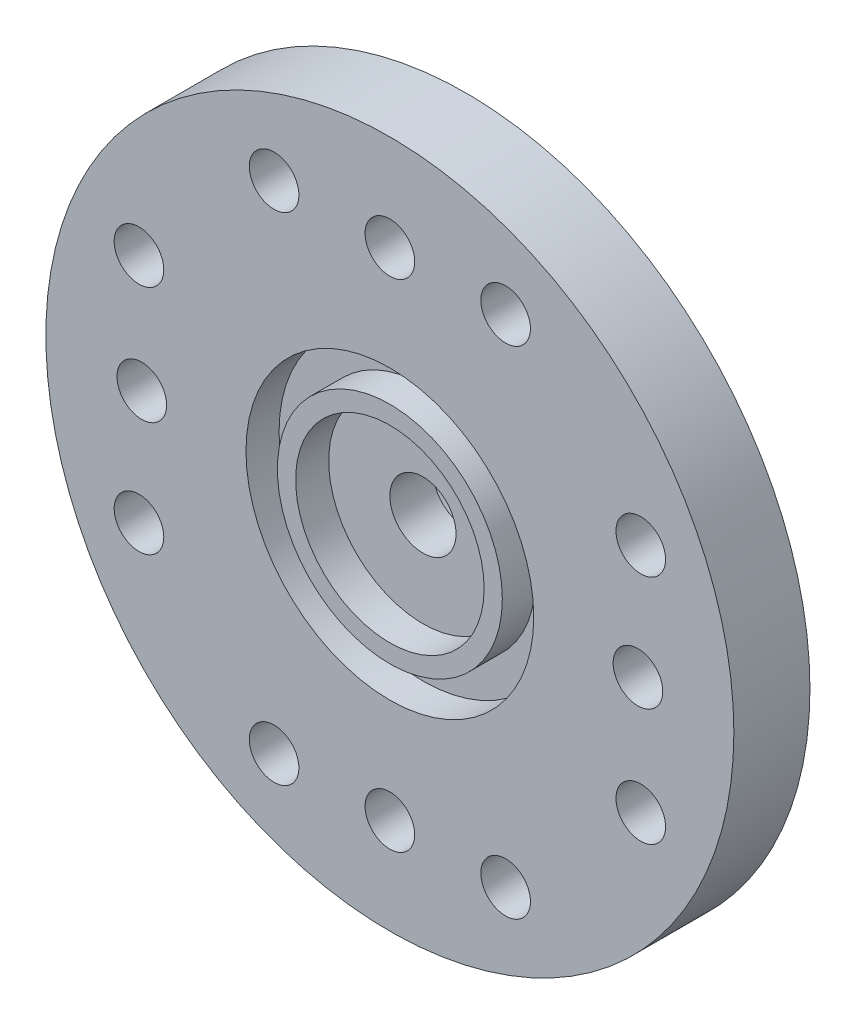
ISO-10303-21;
HEADER;
FILE_DESCRIPTION(('STEP AP214'),'2;1');
FILE_NAME('part.step','',(''),(''),'','','');
FILE_SCHEMA(('AUTOMOTIVE_DESIGN { 1 0 10303 214 1 1 1 1 }'));
ENDSEC;
DATA;
#1=APPLICATION_CONTEXT('core data for automotive mechanical design processes');
#2=APPLICATION_PROTOCOL_DEFINITION('international standard','automotive_design',2000,#1);
#3=PRODUCT_CONTEXT('',#1,'mechanical');
#4=PRODUCT('Part','Part','',(#3));
#5=PRODUCT_RELATED_PRODUCT_CATEGORY('part','',(#4));
#6=PRODUCT_DEFINITION_FORMATION('','',#4);
#7=PRODUCT_DEFINITION_CONTEXT('part definition',#1,'design');
#8=PRODUCT_DEFINITION('design','',#6,#7);
#9=PRODUCT_DEFINITION_SHAPE('','',#8);
#10=(LENGTH_UNIT() NAMED_UNIT(*) SI_UNIT(.MILLI.,.METRE.));
#11=(NAMED_UNIT(*) PLANE_ANGLE_UNIT() SI_UNIT($,.RADIAN.));
#12=(NAMED_UNIT(*) SI_UNIT($,.STERADIAN.) SOLID_ANGLE_UNIT());
#13=UNCERTAINTY_MEASURE_WITH_UNIT(LENGTH_MEASURE(1.E-05),#10,'distance_accuracy_value','');
#14=(GEOMETRIC_REPRESENTATION_CONTEXT(3) GLOBAL_UNCERTAINTY_ASSIGNED_CONTEXT((#13)) GLOBAL_UNIT_ASSIGNED_CONTEXT((#10,
#11,#12)) REPRESENTATION_CONTEXT('',''));
#15=CARTESIAN_POINT('',(0.,0.,0.));
#16=DIRECTION('',(0.,0.,1.));
#17=DIRECTION('',(1.,0.,0.));
#18=AXIS2_PLACEMENT_3D('',#15,#16,#17);
#19=CARTESIAN_POINT('',(0.,0.,2.3));
#20=DIRECTION('',(0.,0.,-1.));
#21=DIRECTION('',(-1.,0.,0.));
#22=AXIS2_PLACEMENT_3D('',#19,#20,#21);
#23=CYLINDRICAL_SURFACE('',#22,10.4);
#24=CARTESIAN_POINT('',(0.,0.,2.3));
#25=DIRECTION('',(0.,0.,1.));
#26=DIRECTION('',(1.,0.,0.));
#27=AXIS2_PLACEMENT_3D('',#24,#25,#26);
#28=CIRCLE('',#27,10.4);
#29=CARTESIAN_POINT('',(10.4,0.,2.3));
#30=VERTEX_POINT('',#29);
#31=EDGE_CURVE('E45',#30,#30,#28,.T.);
#32=ORIENTED_EDGE('',*,*,#31,.F.);
#33=EDGE_LOOP('',(#32));
#34=FACE_BOUND('',#33,.T.);
#35=CARTESIAN_POINT('',(0.,0.,0.));
#36=DIRECTION('',(0.,0.,1.));
#37=DIRECTION('',(1.,0.,0.));
#38=AXIS2_PLACEMENT_3D('',#35,#36,#37);
#39=CIRCLE('',#38,10.4);
#40=CARTESIAN_POINT('',(10.4,0.,0.));
#41=VERTEX_POINT('',#40);
#42=EDGE_CURVE('E49',#41,#41,#39,.T.);
#43=ORIENTED_EDGE('',*,*,#42,.T.);
#44=EDGE_LOOP('',(#43));
#45=FACE_BOUND('',#44,.T.);
#46=ADVANCED_FACE('F38',(#34,#45),#23,.T.);
#47=CARTESIAN_POINT('',(0.,0.,2.3));
#48=DIRECTION('',(0.,0.,1.));
#49=DIRECTION('',(1.,0.,0.));
#50=AXIS2_PLACEMENT_3D('',#47,#48,#49);
#51=PLANE('',#50);
#52=CARTESIAN_POINT('',(0.,0.,2.3));
#53=DIRECTION('',(0.,0.,1.));
#54=DIRECTION('',(1.,0.,0.));
#55=AXIS2_PLACEMENT_3D('',#52,#53,#54);
#56=CIRCLE('',#55,4.35);
#57=CARTESIAN_POINT('',(4.35,0.,2.3));
#58=VERTEX_POINT('',#57);
#59=EDGE_CURVE('E136',#58,#58,#56,.T.);
#60=ORIENTED_EDGE('',*,*,#59,.F.);
#61=EDGE_LOOP('',(#60));
#62=FACE_BOUND('',#61,.T.);
#63=CARTESIAN_POINT('',(7.5,0.,2.3));
#64=DIRECTION('',(0.,0.,1.));
#65=DIRECTION('',(1.,0.,0.));
#66=AXIS2_PLACEMENT_3D('',#63,#64,#65);
#67=CIRCLE('',#66,0.750000024000001);
#68=CARTESIAN_POINT('',(8.250000024,0.,2.3));
#69=VERTEX_POINT('',#68);
#70=EDGE_CURVE('E123',#69,#69,#67,.T.);
#71=ORIENTED_EDGE('',*,*,#70,.F.);
#72=EDGE_LOOP('',(#71));
#73=FACE_BOUND('',#72,.T.);
#74=CARTESIAN_POINT('',(7.58479022540826,3.5,2.3));
#75=DIRECTION('',(0.,0.,1.));
#76=DIRECTION('',(1.,0.,0.));
#77=AXIS2_PLACEMENT_3D('',#74,#75,#76);
#78=CIRCLE('',#77,0.750000024000001);
#79=CARTESIAN_POINT('',(8.33479024940826,3.5,2.3));
#80=VERTEX_POINT('',#79);
#81=EDGE_CURVE('E117',#80,#80,#78,.T.);
#82=ORIENTED_EDGE('',*,*,#81,.F.);
#83=EDGE_LOOP('',(#82));
#84=FACE_BOUND('',#83,.T.);
#85=CARTESIAN_POINT('',(7.58479022540826,-3.5,2.3));
#86=DIRECTION('',(0.,0.,1.));
#87=DIRECTION('',(1.,0.,0.));
#88=AXIS2_PLACEMENT_3D('',#85,#86,#87);
#89=CIRCLE('',#88,0.750000024000001);
#90=CARTESIAN_POINT('',(8.33479024940826,-3.5,2.3));
#91=VERTEX_POINT('',#90);
#92=EDGE_CURVE('E111',#91,#91,#89,.T.);
#93=ORIENTED_EDGE('',*,*,#92,.F.);
#94=EDGE_LOOP('',(#93));
#95=FACE_BOUND('',#94,.T.);
#96=CARTESIAN_POINT('',(0.,-7.5,2.3));
#97=DIRECTION('',(0.,0.,1.));
#98=DIRECTION('',(1.,0.,0.));
#99=AXIS2_PLACEMENT_3D('',#96,#97,#98);
#100=CIRCLE('',#99,0.750000024);
#101=CARTESIAN_POINT('',(0.750000024,-7.5,2.3));
#102=VERTEX_POINT('',#101);
#103=EDGE_CURVE('E105',#102,#102,#100,.T.);
#104=ORIENTED_EDGE('',*,*,#103,.F.);
#105=EDGE_LOOP('',(#104));
#106=FACE_BOUND('',#105,.T.);
#107=CARTESIAN_POINT('',(-3.5,-7.5,2.3));
#108=DIRECTION('',(0.,0.,1.));
#109=DIRECTION('',(1.,0.,0.));
#110=AXIS2_PLACEMENT_3D('',#107,#108,#109);
#111=CIRCLE('',#110,0.750000024);
#112=CARTESIAN_POINT('',(-2.749999976,-7.5,2.3));
#113=VERTEX_POINT('',#112);
#114=EDGE_CURVE('E99',#113,#113,#111,.T.);
#115=ORIENTED_EDGE('',*,*,#114,.F.);
#116=EDGE_LOOP('',(#115));
#117=FACE_BOUND('',#116,.T.);
#118=CARTESIAN_POINT('',(3.5,-7.5,2.3));
#119=DIRECTION('',(0.,0.,1.));
#120=DIRECTION('',(1.,0.,0.));
#121=AXIS2_PLACEMENT_3D('',#118,#119,#120);
#122=CIRCLE('',#121,0.750000024);
#123=CARTESIAN_POINT('',(4.250000024,-7.5,2.3));
#124=VERTEX_POINT('',#123);
#125=EDGE_CURVE('E93',#124,#124,#122,.T.);
#126=ORIENTED_EDGE('',*,*,#125,.F.);
#127=EDGE_LOOP('',(#126));
#128=FACE_BOUND('',#127,.T.);
#129=CARTESIAN_POINT('',(0.,7.5,2.3));
#130=DIRECTION('',(0.,0.,1.));
#131=DIRECTION('',(1.,0.,0.));
#132=AXIS2_PLACEMENT_3D('',#129,#130,#131);
#133=CIRCLE('',#132,0.750000024);
#134=CARTESIAN_POINT('',(0.750000024,7.5,2.3));
#135=VERTEX_POINT('',#134);
#136=EDGE_CURVE('E87',#135,#135,#133,.T.);
#137=ORIENTED_EDGE('',*,*,#136,.F.);
#138=EDGE_LOOP('',(#137));
#139=FACE_BOUND('',#138,.T.);
#140=CARTESIAN_POINT('',(-3.5,7.5,2.3));
#141=DIRECTION('',(0.,0.,1.));
#142=DIRECTION('',(1.,0.,0.));
#143=AXIS2_PLACEMENT_3D('',#140,#141,#142);
#144=CIRCLE('',#143,0.750000024);
#145=CARTESIAN_POINT('',(-2.749999976,7.5,2.3));
#146=VERTEX_POINT('',#145);
#147=EDGE_CURVE('E81',#146,#146,#144,.T.);
#148=ORIENTED_EDGE('',*,*,#147,.F.);
#149=EDGE_LOOP('',(#148));
#150=FACE_BOUND('',#149,.T.);
#151=CARTESIAN_POINT('',(3.5,7.5,2.3));
#152=DIRECTION('',(0.,0.,1.));
#153=DIRECTION('',(1.,0.,0.));
#154=AXIS2_PLACEMENT_3D('',#151,#152,#153);
#155=CIRCLE('',#154,0.750000024);
#156=CARTESIAN_POINT('',(4.250000024,7.5,2.3));
#157=VERTEX_POINT('',#156);
#158=EDGE_CURVE('E75',#157,#157,#155,.T.);
#159=ORIENTED_EDGE('',*,*,#158,.F.);
#160=EDGE_LOOP('',(#159));
#161=FACE_BOUND('',#160,.T.);
#162=CARTESIAN_POINT('',(-7.5,0.,2.3));
#163=DIRECTION('',(0.,0.,1.));
#164=DIRECTION('',(1.,0.,0.));
#165=AXIS2_PLACEMENT_3D('',#162,#163,#164);
#166=CIRCLE('',#165,0.750000024);
#167=CARTESIAN_POINT('',(-6.749999976,0.,2.3));
#168=VERTEX_POINT('',#167);
#169=EDGE_CURVE('E69',#168,#168,#166,.T.);
#170=ORIENTED_EDGE('',*,*,#169,.F.);
#171=EDGE_LOOP('',(#170));
#172=FACE_BOUND('',#171,.T.);
#173=CARTESIAN_POINT('',(-7.58479022540826,3.5,2.3));
#174=DIRECTION('',(0.,0.,1.));
#175=DIRECTION('',(1.,0.,0.));
#176=AXIS2_PLACEMENT_3D('',#173,#174,#175);
#177=CIRCLE('',#176,0.750000024);
#178=CARTESIAN_POINT('',(-6.83479020140826,3.5,2.3));
#179=VERTEX_POINT('',#178);
#180=EDGE_CURVE('E63',#179,#179,#177,.T.);
#181=ORIENTED_EDGE('',*,*,#180,.F.);
#182=EDGE_LOOP('',(#181));
#183=FACE_BOUND('',#182,.T.);
#184=CARTESIAN_POINT('',(-7.58479022540826,-3.5,2.3));
#185=DIRECTION('',(0.,0.,1.));
#186=DIRECTION('',(1.,0.,0.));
#187=AXIS2_PLACEMENT_3D('',#184,#185,#186);
#188=CIRCLE('',#187,0.750000024);
#189=CARTESIAN_POINT('',(-6.83479020140826,-3.5,2.3));
#190=VERTEX_POINT('',#189);
#191=EDGE_CURVE('E57',#190,#190,#188,.T.);
#192=ORIENTED_EDGE('',*,*,#191,.F.);
#193=EDGE_LOOP('',(#192));
#194=FACE_BOUND('',#193,.T.);
#195=ORIENTED_EDGE('',*,*,#31,.T.);
#196=EDGE_LOOP('',(#195));
#197=FACE_BOUND('',#196,.T.);
#198=ADVANCED_FACE('F174',(#62,#73,#84,#95,#106,#117,#128,#139,#150,#161,#172,#183,#194,#197),
#51,.T.);
#199=CARTESIAN_POINT('',(0.,0.,0.));
#200=DIRECTION('',(0.,0.,1.));
#201=DIRECTION('',(1.,0.,0.));
#202=AXIS2_PLACEMENT_3D('',#199,#200,#201);
#203=PLANE('',#202);
#204=CARTESIAN_POINT('',(0.,0.,0.));
#205=DIRECTION('',(0.,0.,1.));
#206=DIRECTION('',(1.,0.,0.));
#207=AXIS2_PLACEMENT_3D('',#204,#205,#206);
#208=CIRCLE('',#207,4.4);
#209=CARTESIAN_POINT('',(4.4,0.,0.));
#210=VERTEX_POINT('',#209);
#211=EDGE_CURVE('E10',#210,#210,#208,.F.);
#212=ORIENTED_EDGE('',*,*,#211,.F.);
#213=EDGE_LOOP('',(#212));
#214=FACE_BOUND('',#213,.T.);
#215=CARTESIAN_POINT('',(7.5,0.,0.));
#216=DIRECTION('',(0.,0.,1.));
#217=DIRECTION('',(1.,0.,0.));
#218=AXIS2_PLACEMENT_3D('',#215,#216,#217);
#219=CIRCLE('',#218,0.750000023999999);
#220=CARTESIAN_POINT('',(8.250000024,0.,0.));
#221=VERTEX_POINT('',#220);
#222=EDGE_CURVE('E120',#221,#221,#219,.T.);
#223=ORIENTED_EDGE('',*,*,#222,.T.);
#224=EDGE_LOOP('',(#223));
#225=FACE_BOUND('',#224,.T.);
#226=CARTESIAN_POINT('',(7.58479022540826,3.5,0.));
#227=DIRECTION('',(0.,0.,1.));
#228=DIRECTION('',(1.,0.,0.));
#229=AXIS2_PLACEMENT_3D('',#226,#227,#228);
#230=CIRCLE('',#229,0.750000023999999);
#231=CARTESIAN_POINT('',(8.33479024940825,3.5,0.));
#232=VERTEX_POINT('',#231);
#233=EDGE_CURVE('E114',#232,#232,#230,.T.);
#234=ORIENTED_EDGE('',*,*,#233,.T.);
#235=EDGE_LOOP('',(#234));
#236=FACE_BOUND('',#235,.T.);
#237=CARTESIAN_POINT('',(7.58479022540826,-3.5,0.));
#238=DIRECTION('',(0.,0.,1.));
#239=DIRECTION('',(1.,0.,0.));
#240=AXIS2_PLACEMENT_3D('',#237,#238,#239);
#241=CIRCLE('',#240,0.750000023999999);
#242=CARTESIAN_POINT('',(8.33479024940825,-3.5,0.));
#243=VERTEX_POINT('',#242);
#244=EDGE_CURVE('E108',#243,#243,#241,.T.);
#245=ORIENTED_EDGE('',*,*,#244,.T.);
#246=EDGE_LOOP('',(#245));
#247=FACE_BOUND('',#246,.T.);
#248=CARTESIAN_POINT('',(0.,-7.5,0.));
#249=DIRECTION('',(0.,0.,1.));
#250=DIRECTION('',(1.,0.,0.));
#251=AXIS2_PLACEMENT_3D('',#248,#249,#250);
#252=CIRCLE('',#251,0.750000023999999);
#253=CARTESIAN_POINT('',(0.750000023999999,-7.5,0.));
#254=VERTEX_POINT('',#253);
#255=EDGE_CURVE('E102',#254,#254,#252,.T.);
#256=ORIENTED_EDGE('',*,*,#255,.T.);
#257=EDGE_LOOP('',(#256));
#258=FACE_BOUND('',#257,.T.);
#259=CARTESIAN_POINT('',(-3.5,-7.5,0.));
#260=DIRECTION('',(0.,0.,1.));
#261=DIRECTION('',(1.,0.,0.));
#262=AXIS2_PLACEMENT_3D('',#259,#260,#261);
#263=CIRCLE('',#262,0.750000023999999);
#264=CARTESIAN_POINT('',(-2.749999976,-7.5,0.));
#265=VERTEX_POINT('',#264);
#266=EDGE_CURVE('E96',#265,#265,#263,.T.);
#267=ORIENTED_EDGE('',*,*,#266,.T.);
#268=EDGE_LOOP('',(#267));
#269=FACE_BOUND('',#268,.T.);
#270=CARTESIAN_POINT('',(3.5,-7.5,0.));
#271=DIRECTION('',(0.,0.,1.));
#272=DIRECTION('',(1.,0.,0.));
#273=AXIS2_PLACEMENT_3D('',#270,#271,#272);
#274=CIRCLE('',#273,0.750000023999999);
#275=CARTESIAN_POINT('',(4.250000024,-7.5,0.));
#276=VERTEX_POINT('',#275);
#277=EDGE_CURVE('E90',#276,#276,#274,.T.);
#278=ORIENTED_EDGE('',*,*,#277,.T.);
#279=EDGE_LOOP('',(#278));
#280=FACE_BOUND('',#279,.T.);
#281=CARTESIAN_POINT('',(0.,7.5,0.));
#282=DIRECTION('',(0.,0.,1.));
#283=DIRECTION('',(1.,0.,0.));
#284=AXIS2_PLACEMENT_3D('',#281,#282,#283);
#285=CIRCLE('',#284,0.750000023999999);
#286=CARTESIAN_POINT('',(0.750000023999999,7.5,0.));
#287=VERTEX_POINT('',#286);
#288=EDGE_CURVE('E84',#287,#287,#285,.T.);
#289=ORIENTED_EDGE('',*,*,#288,.T.);
#290=EDGE_LOOP('',(#289));
#291=FACE_BOUND('',#290,.T.);
#292=CARTESIAN_POINT('',(-3.5,7.5,0.));
#293=DIRECTION('',(0.,0.,1.));
#294=DIRECTION('',(1.,0.,0.));
#295=AXIS2_PLACEMENT_3D('',#292,#293,#294);
#296=CIRCLE('',#295,0.750000023999999);
#297=CARTESIAN_POINT('',(-2.749999976,7.5,0.));
#298=VERTEX_POINT('',#297);
#299=EDGE_CURVE('E78',#298,#298,#296,.T.);
#300=ORIENTED_EDGE('',*,*,#299,.T.);
#301=EDGE_LOOP('',(#300));
#302=FACE_BOUND('',#301,.T.);
#303=CARTESIAN_POINT('',(3.5,7.5,0.));
#304=DIRECTION('',(0.,0.,1.));
#305=DIRECTION('',(1.,0.,0.));
#306=AXIS2_PLACEMENT_3D('',#303,#304,#305);
#307=CIRCLE('',#306,0.750000023999999);
#308=CARTESIAN_POINT('',(4.250000024,7.5,0.));
#309=VERTEX_POINT('',#308);
#310=EDGE_CURVE('E72',#309,#309,#307,.T.);
#311=ORIENTED_EDGE('',*,*,#310,.T.);
#312=EDGE_LOOP('',(#311));
#313=FACE_BOUND('',#312,.T.);
#314=CARTESIAN_POINT('',(-7.5,0.,0.));
#315=DIRECTION('',(0.,0.,1.));
#316=DIRECTION('',(1.,0.,0.));
#317=AXIS2_PLACEMENT_3D('',#314,#315,#316);
#318=CIRCLE('',#317,0.750000024);
#319=CARTESIAN_POINT('',(-6.749999976,0.,0.));
#320=VERTEX_POINT('',#319);
#321=EDGE_CURVE('E66',#320,#320,#318,.T.);
#322=ORIENTED_EDGE('',*,*,#321,.T.);
#323=EDGE_LOOP('',(#322));
#324=FACE_BOUND('',#323,.T.);
#325=CARTESIAN_POINT('',(-7.58479022540826,3.5,0.));
#326=DIRECTION('',(0.,0.,1.));
#327=DIRECTION('',(1.,0.,0.));
#328=AXIS2_PLACEMENT_3D('',#325,#326,#327);
#329=CIRCLE('',#328,0.750000024);
#330=CARTESIAN_POINT('',(-6.83479020140826,3.5,0.));
#331=VERTEX_POINT('',#330);
#332=EDGE_CURVE('E60',#331,#331,#329,.T.);
#333=ORIENTED_EDGE('',*,*,#332,.T.);
#334=EDGE_LOOP('',(#333));
#335=FACE_BOUND('',#334,.T.);
#336=CARTESIAN_POINT('',(-7.58479022540826,-3.5,0.));
#337=DIRECTION('',(0.,0.,1.));
#338=DIRECTION('',(1.,0.,0.));
#339=AXIS2_PLACEMENT_3D('',#336,#337,#338);
#340=CIRCLE('',#339,0.750000024);
#341=CARTESIAN_POINT('',(-6.83479020140826,-3.5,0.));
#342=VERTEX_POINT('',#341);
#343=EDGE_CURVE('E53',#342,#342,#340,.T.);
#344=ORIENTED_EDGE('',*,*,#343,.T.);
#345=EDGE_LOOP('',(#344));
#346=FACE_BOUND('',#345,.T.);
#347=ORIENTED_EDGE('',*,*,#42,.F.);
#348=EDGE_LOOP('',(#347));
#349=FACE_BOUND('',#348,.T.);
#350=ADVANCED_FACE('F179',(#214,#225,#236,#247,#258,#269,#280,#291,#302,#313,#324,#335,#346,
#349),#203,.F.);
#351=CARTESIAN_POINT('',(-7.58479022540826,-3.5,2.3));
#352=DIRECTION('',(0.,0.,1.));
#353=DIRECTION('',(1.,0.,0.));
#354=AXIS2_PLACEMENT_3D('',#351,#352,#353);
#355=CYLINDRICAL_SURFACE('',#354,0.750000024);
#356=ORIENTED_EDGE('',*,*,#343,.F.);
#357=EDGE_LOOP('',(#356));
#358=FACE_BOUND('',#357,.T.);
#359=ORIENTED_EDGE('',*,*,#191,.T.);
#360=EDGE_LOOP('',(#359));
#361=FACE_BOUND('',#360,.T.);
#362=ADVANCED_FACE('F188',(#358,#361),#355,.F.);
#363=CARTESIAN_POINT('',(-7.58479022540826,3.5,2.3));
#364=DIRECTION('',(0.,0.,1.));
#365=DIRECTION('',(1.,0.,0.));
#366=AXIS2_PLACEMENT_3D('',#363,#364,#365);
#367=CYLINDRICAL_SURFACE('',#366,0.750000024);
#368=ORIENTED_EDGE('',*,*,#332,.F.);
#369=EDGE_LOOP('',(#368));
#370=FACE_BOUND('',#369,.T.);
#371=ORIENTED_EDGE('',*,*,#180,.T.);
#372=EDGE_LOOP('',(#371));
#373=FACE_BOUND('',#372,.T.);
#374=ADVANCED_FACE('F193',(#370,#373),#367,.F.);
#375=CARTESIAN_POINT('',(-7.5,0.,2.3));
#376=DIRECTION('',(0.,0.,1.));
#377=DIRECTION('',(1.,0.,0.));
#378=AXIS2_PLACEMENT_3D('',#375,#376,#377);
#379=CYLINDRICAL_SURFACE('',#378,0.750000024);
#380=ORIENTED_EDGE('',*,*,#321,.F.);
#381=EDGE_LOOP('',(#380));
#382=FACE_BOUND('',#381,.T.);
#383=ORIENTED_EDGE('',*,*,#169,.T.);
#384=EDGE_LOOP('',(#383));
#385=FACE_BOUND('',#384,.T.);
#386=ADVANCED_FACE('F257',(#382,#385),#379,.F.);
#387=CARTESIAN_POINT('',(3.5,7.5,2.3));
#388=DIRECTION('',(0.,0.,1.));
#389=DIRECTION('',(1.,0.,0.));
#390=AXIS2_PLACEMENT_3D('',#387,#388,#389);
#391=CYLINDRICAL_SURFACE('',#390,0.750000024);
#392=ORIENTED_EDGE('',*,*,#310,.F.);
#393=EDGE_LOOP('',(#392));
#394=FACE_BOUND('',#393,.T.);
#395=ORIENTED_EDGE('',*,*,#158,.T.);
#396=EDGE_LOOP('',(#395));
#397=FACE_BOUND('',#396,.T.);
#398=ADVANCED_FACE('F253',(#394,#397),#391,.F.);
#399=CARTESIAN_POINT('',(-3.5,7.5,2.3));
#400=DIRECTION('',(0.,0.,1.));
#401=DIRECTION('',(1.,0.,0.));
#402=AXIS2_PLACEMENT_3D('',#399,#400,#401);
#403=CYLINDRICAL_SURFACE('',#402,0.750000023999999);
#404=ORIENTED_EDGE('',*,*,#299,.F.);
#405=EDGE_LOOP('',(#404));
#406=FACE_BOUND('',#405,.T.);
#407=ORIENTED_EDGE('',*,*,#147,.T.);
#408=EDGE_LOOP('',(#407));
#409=FACE_BOUND('',#408,.T.);
#410=ADVANCED_FACE('F249',(#406,#409),#403,.F.);
#411=CARTESIAN_POINT('',(0.,7.5,2.3));
#412=DIRECTION('',(0.,0.,1.));
#413=DIRECTION('',(1.,0.,0.));
#414=AXIS2_PLACEMENT_3D('',#411,#412,#413);
#415=CYLINDRICAL_SURFACE('',#414,0.750000023999999);
#416=ORIENTED_EDGE('',*,*,#288,.F.);
#417=EDGE_LOOP('',(#416));
#418=FACE_BOUND('',#417,.T.);
#419=ORIENTED_EDGE('',*,*,#136,.T.);
#420=EDGE_LOOP('',(#419));
#421=FACE_BOUND('',#420,.T.);
#422=ADVANCED_FACE('F245',(#418,#421),#415,.F.);
#423=CARTESIAN_POINT('',(3.5,-7.5,2.3));
#424=DIRECTION('',(0.,0.,1.));
#425=DIRECTION('',(1.,0.,0.));
#426=AXIS2_PLACEMENT_3D('',#423,#424,#425);
#427=CYLINDRICAL_SURFACE('',#426,0.750000024);
#428=ORIENTED_EDGE('',*,*,#277,.F.);
#429=EDGE_LOOP('',(#428));
#430=FACE_BOUND('',#429,.T.);
#431=ORIENTED_EDGE('',*,*,#125,.T.);
#432=EDGE_LOOP('',(#431));
#433=FACE_BOUND('',#432,.T.);
#434=ADVANCED_FACE('F241',(#430,#433),#427,.F.);
#435=CARTESIAN_POINT('',(-3.5,-7.5,2.3));
#436=DIRECTION('',(0.,0.,1.));
#437=DIRECTION('',(1.,0.,0.));
#438=AXIS2_PLACEMENT_3D('',#435,#436,#437);
#439=CYLINDRICAL_SURFACE('',#438,0.750000023999999);
#440=ORIENTED_EDGE('',*,*,#266,.F.);
#441=EDGE_LOOP('',(#440));
#442=FACE_BOUND('',#441,.T.);
#443=ORIENTED_EDGE('',*,*,#114,.T.);
#444=EDGE_LOOP('',(#443));
#445=FACE_BOUND('',#444,.T.);
#446=ADVANCED_FACE('F237',(#442,#445),#439,.F.);
#447=CARTESIAN_POINT('',(0.,-7.5,2.3));
#448=DIRECTION('',(0.,0.,1.));
#449=DIRECTION('',(1.,0.,0.));
#450=AXIS2_PLACEMENT_3D('',#447,#448,#449);
#451=CYLINDRICAL_SURFACE('',#450,0.750000023999999);
#452=ORIENTED_EDGE('',*,*,#255,.F.);
#453=EDGE_LOOP('',(#452));
#454=FACE_BOUND('',#453,.T.);
#455=ORIENTED_EDGE('',*,*,#103,.T.);
#456=EDGE_LOOP('',(#455));
#457=FACE_BOUND('',#456,.T.);
#458=ADVANCED_FACE('F233',(#454,#457),#451,.F.);
#459=CARTESIAN_POINT('',(7.58479022540826,-3.5,2.3));
#460=DIRECTION('',(0.,0.,1.));
#461=DIRECTION('',(1.,0.,0.));
#462=AXIS2_PLACEMENT_3D('',#459,#460,#461);
#463=CYLINDRICAL_SURFACE('',#462,0.750000024);
#464=ORIENTED_EDGE('',*,*,#244,.F.);
#465=EDGE_LOOP('',(#464));
#466=FACE_BOUND('',#465,.T.);
#467=ORIENTED_EDGE('',*,*,#92,.T.);
#468=EDGE_LOOP('',(#467));
#469=FACE_BOUND('',#468,.T.);
#470=ADVANCED_FACE('F229',(#466,#469),#463,.F.);
#471=CARTESIAN_POINT('',(7.58479022540826,3.5,2.3));
#472=DIRECTION('',(0.,0.,1.));
#473=DIRECTION('',(1.,0.,0.));
#474=AXIS2_PLACEMENT_3D('',#471,#472,#473);
#475=CYLINDRICAL_SURFACE('',#474,0.750000024);
#476=ORIENTED_EDGE('',*,*,#233,.F.);
#477=EDGE_LOOP('',(#476));
#478=FACE_BOUND('',#477,.T.);
#479=ORIENTED_EDGE('',*,*,#81,.T.);
#480=EDGE_LOOP('',(#479));
#481=FACE_BOUND('',#480,.T.);
#482=ADVANCED_FACE('F225',(#478,#481),#475,.F.);
#483=CARTESIAN_POINT('',(7.5,0.,2.3));
#484=DIRECTION('',(0.,0.,1.));
#485=DIRECTION('',(1.,0.,0.));
#486=AXIS2_PLACEMENT_3D('',#483,#484,#485);
#487=CYLINDRICAL_SURFACE('',#486,0.750000024);
#488=ORIENTED_EDGE('',*,*,#222,.F.);
#489=EDGE_LOOP('',(#488));
#490=FACE_BOUND('',#489,.T.);
#491=ORIENTED_EDGE('',*,*,#70,.T.);
#492=EDGE_LOOP('',(#491));
#493=FACE_BOUND('',#492,.T.);
#494=ADVANCED_FACE('F220',(#490,#493),#487,.F.);
#495=CARTESIAN_POINT('',(0.,0.,-3.));
#496=DIRECTION('',(0.,0.,-1.));
#497=DIRECTION('',(-1.,0.,0.));
#498=AXIS2_PLACEMENT_3D('',#495,#496,#497);
#499=PLANE('',#498);
#500=CARTESIAN_POINT('',(0.,0.,-3.));
#501=DIRECTION('',(0.,0.,-1.));
#502=DIRECTION('',(-1.,0.,0.));
#503=AXIS2_PLACEMENT_3D('',#500,#501,#502);
#504=CIRCLE('',#503,4.4);
#505=CARTESIAN_POINT('',(-4.4,0.,-3.));
#506=VERTEX_POINT('',#505);
#507=EDGE_CURVE('E126',#506,#506,#504,.T.);
#508=ORIENTED_EDGE('',*,*,#507,.T.);
#509=EDGE_LOOP('',(#508));
#510=FACE_BOUND('',#509,.T.);
#511=CARTESIAN_POINT('',(0.,0.,-3.));
#512=DIRECTION('',(0.,0.,-1.));
#513=DIRECTION('',(-1.,0.,0.));
#514=AXIS2_PLACEMENT_3D('',#511,#512,#513);
#515=CIRCLE('',#514,3.);
#516=CARTESIAN_POINT('',(-3.,0.,-3.));
#517=VERTEX_POINT('',#516);
#518=EDGE_CURVE('E129',#517,#517,#515,.T.);
#519=ORIENTED_EDGE('',*,*,#518,.F.);
#520=EDGE_LOOP('',(#519));
#521=FACE_BOUND('',#520,.T.);
#522=ADVANCED_FACE('F213',(#510,#521),#499,.T.);
#523=CARTESIAN_POINT('',(0.,0.,-3.));
#524=DIRECTION('',(0.,0.,1.));
#525=DIRECTION('',(1.,0.,0.));
#526=AXIS2_PLACEMENT_3D('',#523,#524,#525);
#527=CYLINDRICAL_SURFACE('',#526,4.4);
#528=ORIENTED_EDGE('',*,*,#507,.F.);
#529=EDGE_LOOP('',(#528));
#530=FACE_BOUND('',#529,.T.);
#531=ORIENTED_EDGE('',*,*,#211,.T.);
#532=EDGE_LOOP('',(#531));
#533=FACE_BOUND('',#532,.T.);
#534=ADVANCED_FACE('F207',(#530,#533),#527,.T.);
#535=CARTESIAN_POINT('',(0.,0.,-3.));
#536=DIRECTION('',(0.,0.,1.));
#537=DIRECTION('',(1.,0.,0.));
#538=AXIS2_PLACEMENT_3D('',#535,#536,#537);
#539=CYLINDRICAL_SURFACE('',#538,3.);
#540=ORIENTED_EDGE('',*,*,#518,.T.);
#541=EDGE_LOOP('',(#540));
#542=FACE_BOUND('',#541,.T.);
#543=CARTESIAN_POINT('',(0.,0.,0.));
#544=DIRECTION('',(0.,0.,-1.));
#545=DIRECTION('',(-1.,0.,0.));
#546=AXIS2_PLACEMENT_3D('',#543,#544,#545);
#547=CIRCLE('',#546,3.);
#548=CARTESIAN_POINT('',(-3.,0.,0.));
#549=VERTEX_POINT('',#548);
#550=EDGE_CURVE('E130',#549,#549,#547,.T.);
#551=ORIENTED_EDGE('',*,*,#550,.F.);
#552=EDGE_LOOP('',(#551));
#553=FACE_BOUND('',#552,.T.);
#554=ADVANCED_FACE('F199',(#542,#553),#539,.F.);
#555=CARTESIAN_POINT('',(0.,0.,0.));
#556=DIRECTION('',(0.,0.,1.));
#557=DIRECTION('',(1.,0.,0.));
#558=AXIS2_PLACEMENT_3D('',#555,#556,#557);
#559=CIRCLE('',#558,1.);
#560=CARTESIAN_POINT('',(1.,0.,0.));
#561=VERTEX_POINT('',#560);
#562=EDGE_CURVE('E41',#561,#561,#559,.T.);
#563=ORIENTED_EDGE('',*,*,#562,.T.);
#564=EDGE_LOOP('',(#563));
#565=FACE_BOUND('',#564,.T.);
#566=ORIENTED_EDGE('',*,*,#550,.T.);
#567=EDGE_LOOP('',(#566));
#568=FACE_BOUND('',#567,.T.);
#569=ADVANCED_FACE('F160',(#565,#568),#203,.F.);
#570=CARTESIAN_POINT('',(0.,0.,1.3));
#571=DIRECTION('',(0.,0.,1.));
#572=DIRECTION('',(1.,0.,0.));
#573=AXIS2_PLACEMENT_3D('',#570,#571,#572);
#574=CYLINDRICAL_SURFACE('',#573,4.35);
#575=CARTESIAN_POINT('',(0.,0.,1.3));
#576=DIRECTION('',(0.,0.,1.));
#577=DIRECTION('',(1.,0.,0.));
#578=AXIS2_PLACEMENT_3D('',#575,#576,#577);
#579=CIRCLE('',#578,4.35);
#580=CARTESIAN_POINT('',(4.35,0.,1.3));
#581=VERTEX_POINT('',#580);
#582=EDGE_CURVE('E133',#581,#581,#579,.T.);
#583=ORIENTED_EDGE('',*,*,#582,.F.);
#584=EDGE_LOOP('',(#583));
#585=FACE_BOUND('',#584,.T.);
#586=ORIENTED_EDGE('',*,*,#59,.T.);
#587=EDGE_LOOP('',(#586));
#588=FACE_BOUND('',#587,.T.);
#589=ADVANCED_FACE('F198',(#585,#588),#574,.F.);
#590=CARTESIAN_POINT('',(0.,0.,1.3));
#591=DIRECTION('',(0.,0.,1.));
#592=DIRECTION('',(1.,0.,0.));
#593=AXIS2_PLACEMENT_3D('',#590,#591,#592);
#594=PLANE('',#593);
#595=CARTESIAN_POINT('',(0.,0.,1.3));
#596=DIRECTION('',(0.,0.,1.));
#597=DIRECTION('',(1.,0.,0.));
#598=AXIS2_PLACEMENT_3D('',#595,#596,#597);
#599=CIRCLE('',#598,3.4);
#600=CARTESIAN_POINT('',(3.4,0.,1.3));
#601=VERTEX_POINT('',#600);
#602=EDGE_CURVE('E139',#601,#601,#599,.T.);
#603=ORIENTED_EDGE('',*,*,#602,.F.);
#604=EDGE_LOOP('',(#603));
#605=FACE_BOUND('',#604,.T.);
#606=ORIENTED_EDGE('',*,*,#582,.T.);
#607=EDGE_LOOP('',(#606));
#608=FACE_BOUND('',#607,.T.);
#609=ADVANCED_FACE('F204',(#605,#608),#594,.T.);
#610=CARTESIAN_POINT('',(0.,0.,1.3));
#611=DIRECTION('',(0.,0.,1.));
#612=DIRECTION('',(1.,0.,0.));
#613=AXIS2_PLACEMENT_3D('',#610,#611,#612);
#614=CYLINDRICAL_SURFACE('',#613,3.4);
#615=ORIENTED_EDGE('',*,*,#602,.T.);
#616=EDGE_LOOP('',(#615));
#617=FACE_BOUND('',#616,.T.);
#618=CARTESIAN_POINT('',(0.,0.,2.3));
#619=DIRECTION('',(0.,0.,1.));
#620=DIRECTION('',(1.,0.,0.));
#621=AXIS2_PLACEMENT_3D('',#618,#619,#620);
#622=CIRCLE('',#621,3.4);
#623=CARTESIAN_POINT('',(3.4,0.,2.3));
#624=VERTEX_POINT('',#623);
#625=EDGE_CURVE('E142',#624,#624,#622,.T.);
#626=ORIENTED_EDGE('',*,*,#625,.F.);
#627=EDGE_LOOP('',(#626));
#628=FACE_BOUND('',#627,.T.);
#629=ADVANCED_FACE('F354',(#617,#628),#614,.T.);
#630=CARTESIAN_POINT('',(0.,0.,2.3));
#631=DIRECTION('',(0.,0.,1.));
#632=DIRECTION('',(1.,0.,0.));
#633=AXIS2_PLACEMENT_3D('',#630,#631,#632);
#634=CIRCLE('',#633,2.85);
#635=CARTESIAN_POINT('',(2.85,0.,2.3));
#636=VERTEX_POINT('',#635);
#637=EDGE_CURVE('E148',#636,#636,#634,.T.);
#638=ORIENTED_EDGE('',*,*,#637,.F.);
#639=EDGE_LOOP('',(#638));
#640=FACE_BOUND('',#639,.T.);
#641=ORIENTED_EDGE('',*,*,#625,.T.);
#642=EDGE_LOOP('',(#641));
#643=FACE_BOUND('',#642,.T.);
#644=ADVANCED_FACE('F182',(#640,#643),#51,.T.);
#645=CARTESIAN_POINT('',(0.,0.,1.3));
#646=DIRECTION('',(0.,0.,1.));
#647=DIRECTION('',(1.,0.,0.));
#648=AXIS2_PLACEMENT_3D('',#645,#646,#647);
#649=CYLINDRICAL_SURFACE('',#648,2.85);
#650=CARTESIAN_POINT('',(0.,0.,1.3));
#651=DIRECTION('',(0.,0.,1.));
#652=DIRECTION('',(1.,0.,0.));
#653=AXIS2_PLACEMENT_3D('',#650,#651,#652);
#654=CIRCLE('',#653,2.85);
#655=CARTESIAN_POINT('',(2.85,0.,1.3));
#656=VERTEX_POINT('',#655);
#657=EDGE_CURVE('E145',#656,#656,#654,.T.);
#658=ORIENTED_EDGE('',*,*,#657,.F.);
#659=EDGE_LOOP('',(#658));
#660=FACE_BOUND('',#659,.T.);
#661=ORIENTED_EDGE('',*,*,#637,.T.);
#662=EDGE_LOOP('',(#661));
#663=FACE_BOUND('',#662,.T.);
#664=ADVANCED_FACE('F170',(#660,#663),#649,.F.);
#665=CARTESIAN_POINT('',(0.,0.,1.3));
#666=DIRECTION('',(0.,0.,1.));
#667=DIRECTION('',(1.,0.,0.));
#668=AXIS2_PLACEMENT_3D('',#665,#666,#667);
#669=PLANE('',#668);
#670=CARTESIAN_POINT('',(0.,0.,1.3));
#671=DIRECTION('',(0.,0.,1.));
#672=DIRECTION('',(1.,0.,0.));
#673=AXIS2_PLACEMENT_3D('',#670,#671,#672);
#674=CIRCLE('',#673,1.);
#675=CARTESIAN_POINT('',(1.,0.,1.3));
#676=VERTEX_POINT('',#675);
#677=EDGE_CURVE('E153',#676,#676,#674,.T.);
#678=ORIENTED_EDGE('',*,*,#677,.F.);
#679=EDGE_LOOP('',(#678));
#680=FACE_BOUND('',#679,.T.);
#681=ORIENTED_EDGE('',*,*,#657,.T.);
#682=EDGE_LOOP('',(#681));
#683=FACE_BOUND('',#682,.T.);
#684=ADVANCED_FACE('F165',(#680,#683),#669,.T.);
#685=CARTESIAN_POINT('',(0.,0.,-2.7));
#686=DIRECTION('',(0.,0.,1.));
#687=DIRECTION('',(1.,0.,0.));
#688=AXIS2_PLACEMENT_3D('',#685,#686,#687);
#689=CYLINDRICAL_SURFACE('',#688,1.);
#690=ORIENTED_EDGE('',*,*,#677,.T.);
#691=EDGE_LOOP('',(#690));
#692=FACE_BOUND('',#691,.T.);
#693=ORIENTED_EDGE('',*,*,#562,.F.);
#694=EDGE_LOOP('',(#693));
#695=FACE_BOUND('',#694,.T.);
#696=ADVANCED_FACE('F163',(#692,#695),#689,.F.);
#697=CLOSED_SHELL('',(#46,#198,#350,#362,#374,#386,#398,#410,#422,#434,#446,#458,#470,#482,#494,
#522,#534,#554,#569,#589,#609,#629,#644,#664,#684,#696));
#698=MANIFOLD_SOLID_BREP('B2',#697);
#699=ADVANCED_BREP_SHAPE_REPRESENTATION('',(#18,#698),#14);
#700=SHAPE_DEFINITION_REPRESENTATION(#9,#699);
ENDSEC;
END-ISO-10303-21;
